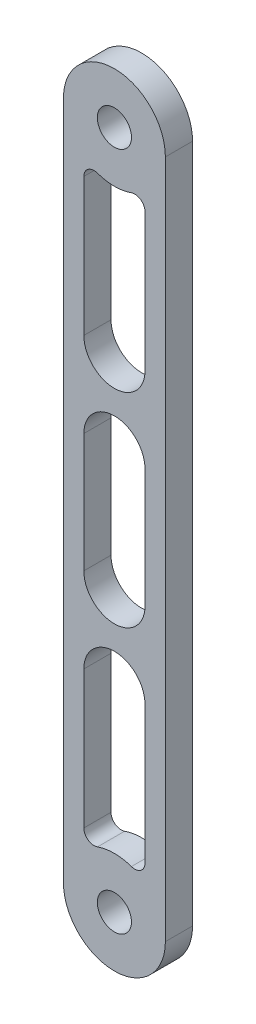
ISO-10303-21;
HEADER;
FILE_DESCRIPTION(('STEP AP214'),'2;1');
FILE_NAME('part.step','',(''),(''),'','','');
FILE_SCHEMA(('AUTOMOTIVE_DESIGN { 1 0 10303 214 1 1 1 1 }'));
ENDSEC;
DATA;
#1=APPLICATION_CONTEXT('core data for automotive mechanical design processes');
#2=APPLICATION_PROTOCOL_DEFINITION('international standard','automotive_design',2000,#1);
#3=PRODUCT_CONTEXT('',#1,'mechanical');
#4=PRODUCT('Part','Part','',(#3));
#5=PRODUCT_RELATED_PRODUCT_CATEGORY('part','',(#4));
#6=PRODUCT_DEFINITION_FORMATION('','',#4);
#7=PRODUCT_DEFINITION_CONTEXT('part definition',#1,'design');
#8=PRODUCT_DEFINITION('design','',#6,#7);
#9=PRODUCT_DEFINITION_SHAPE('','',#8);
#10=(LENGTH_UNIT() NAMED_UNIT(*) SI_UNIT(.MILLI.,.METRE.));
#11=(NAMED_UNIT(*) PLANE_ANGLE_UNIT() SI_UNIT($,.RADIAN.));
#12=(NAMED_UNIT(*) SI_UNIT($,.STERADIAN.) SOLID_ANGLE_UNIT());
#13=UNCERTAINTY_MEASURE_WITH_UNIT(LENGTH_MEASURE(1.E-05),#10,'distance_accuracy_value','');
#14=(GEOMETRIC_REPRESENTATION_CONTEXT(3) GLOBAL_UNCERTAINTY_ASSIGNED_CONTEXT((#13)) GLOBAL_UNIT_ASSIGNED_CONTEXT((#10,
#11,#12)) REPRESENTATION_CONTEXT('',''));
#15=CARTESIAN_POINT('',(0.,0.,0.));
#16=DIRECTION('',(0.,0.,1.));
#17=DIRECTION('',(1.,0.,0.));
#18=AXIS2_PLACEMENT_3D('',#15,#16,#17);
#19=CARTESIAN_POINT('',(0.,0.,8.));
#20=DIRECTION('',(0.,0.,1.));
#21=DIRECTION('',(1.,0.,0.));
#22=AXIS2_PLACEMENT_3D('',#19,#20,#21);
#23=PLANE('',#22);
#24=CARTESIAN_POINT('',(0.,0.,8.));
#25=DIRECTION('',(0.,0.,1.));
#26=DIRECTION('',(1.,0.,0.));
#27=AXIS2_PLACEMENT_3D('',#24,#25,#26);
#28=CIRCLE('',#27,5.025);
#29=CARTESIAN_POINT('',(5.025,0.,8.));
#30=VERTEX_POINT('',#29);
#31=EDGE_CURVE('E314',#30,#30,#28,.T.);
#32=ORIENTED_EDGE('',*,*,#31,.F.);
#33=EDGE_LOOP('',(#32));
#34=FACE_BOUND('',#33,.T.);
#35=CARTESIAN_POINT('',(0.,0.,8.));
#36=DIRECTION('',(0.,0.,1.));
#37=DIRECTION('',(1.,0.,0.));
#38=AXIS2_PLACEMENT_3D('',#35,#36,#37);
#39=CIRCLE('',#38,15.);
#40=CARTESIAN_POINT('',(15.,0.,8.));
#41=VERTEX_POINT('',#40);
#42=CARTESIAN_POINT('',(-15.,0.,8.));
#43=VERTEX_POINT('',#42);
#44=EDGE_CURVE('E320',#41,#43,#39,.T.);
#45=ORIENTED_EDGE('',*,*,#44,.T.);
#46=DIRECTION('',(0.,-1.,0.));
#47=VECTOR('',#46,1.);
#48=CARTESIAN_POINT('',(-15.,0.,8.));
#49=LINE('',#48,#47);
#50=CARTESIAN_POINT('',(-15.,-200.,8.));
#51=VERTEX_POINT('',#50);
#52=EDGE_CURVE('E323',#43,#51,#49,.T.);
#53=ORIENTED_EDGE('',*,*,#52,.T.);
#54=CARTESIAN_POINT('',(0.,-200.,8.));
#55=DIRECTION('',(0.,0.,1.));
#56=DIRECTION('',(1.,0.,0.));
#57=AXIS2_PLACEMENT_3D('',#54,#55,#56);
#58=CIRCLE('',#57,15.);
#59=CARTESIAN_POINT('',(15.,-200.,8.));
#60=VERTEX_POINT('',#59);
#61=EDGE_CURVE('E326',#51,#60,#58,.T.);
#62=ORIENTED_EDGE('',*,*,#61,.T.);
#63=DIRECTION('',(0.,1.,0.));
#64=VECTOR('',#63,1.);
#65=CARTESIAN_POINT('',(15.,0.,8.));
#66=LINE('',#65,#64);
#67=EDGE_CURVE('E328',#60,#41,#66,.T.);
#68=ORIENTED_EDGE('',*,*,#67,.T.);
#69=EDGE_LOOP('',(#45,#53,#62,#68));
#70=FACE_BOUND('',#69,.T.);
#71=CARTESIAN_POINT('',(0.,-200.,8.));
#72=DIRECTION('',(0.,0.,1.));
#73=DIRECTION('',(1.,0.,0.));
#74=AXIS2_PLACEMENT_3D('',#71,#72,#73);
#75=CIRCLE('',#74,5.025);
#76=CARTESIAN_POINT('',(5.025,-200.,8.));
#77=VERTEX_POINT('',#76);
#78=EDGE_CURVE('E308',#77,#77,#75,.T.);
#79=ORIENTED_EDGE('',*,*,#78,.F.);
#80=EDGE_LOOP('',(#79));
#81=FACE_BOUND('',#80,.T.);
#82=DIRECTION('',(0.,1.,0.));
#83=VECTOR('',#82,1.);
#84=CARTESIAN_POINT('',(9.,-16.9705627484771,8.));
#85=LINE('',#84,#83);
#86=CARTESIAN_POINT('',(9.,-57.5,8.));
#87=VERTEX_POINT('',#86);
#88=CARTESIAN_POINT('',(9.,-16.9705627484771,8.));
#89=VERTEX_POINT('',#88);
#90=EDGE_CURVE('E265',#87,#89,#85,.T.);
#91=ORIENTED_EDGE('',*,*,#90,.F.);
#92=CARTESIAN_POINT('',(0.,-57.5,8.));
#93=DIRECTION('',(0.,0.,1.));
#94=DIRECTION('',(1.,0.,0.));
#95=AXIS2_PLACEMENT_3D('',#92,#93,#94);
#96=CIRCLE('',#95,9.);
#97=CARTESIAN_POINT('',(-9.,-57.5,8.));
#98=VERTEX_POINT('',#97);
#99=EDGE_CURVE('E263',#98,#87,#96,.T.);
#100=ORIENTED_EDGE('',*,*,#99,.F.);
#101=DIRECTION('',(0.,-1.,0.));
#102=VECTOR('',#101,1.);
#103=CARTESIAN_POINT('',(-9.,-16.9705627484771,8.));
#104=LINE('',#103,#102);
#105=CARTESIAN_POINT('',(-9.,-16.9705627484771,8.));
#106=VERTEX_POINT('',#105);
#107=EDGE_CURVE('E275',#106,#98,#104,.T.);
#108=ORIENTED_EDGE('',*,*,#107,.F.);
#109=CARTESIAN_POINT('',(-6.,-16.9705627484771,8.));
#110=DIRECTION('',(0.,0.,1.));
#111=DIRECTION('',(1.,0.,0.));
#112=AXIS2_PLACEMENT_3D('',#109,#110,#111);
#113=CIRCLE('',#112,3.);
#114=CARTESIAN_POINT('',(-5.,-14.142135623731,8.));
#115=VERTEX_POINT('',#114);
#116=EDGE_CURVE('E272',#115,#106,#113,.T.);
#117=ORIENTED_EDGE('',*,*,#116,.F.);
#118=CARTESIAN_POINT('',(0.,0.,8.));
#119=DIRECTION('',(0.,0.,-1.));
#120=DIRECTION('',(1.,0.,0.));
#121=AXIS2_PLACEMENT_3D('',#118,#119,#120);
#122=CIRCLE('',#121,15.);
#123=CARTESIAN_POINT('',(5.,-14.142135623731,8.));
#124=VERTEX_POINT('',#123);
#125=EDGE_CURVE('E270',#124,#115,#122,.T.);
#126=ORIENTED_EDGE('',*,*,#125,.F.);
#127=CARTESIAN_POINT('',(6.,-16.9705627484771,8.));
#128=DIRECTION('',(0.,0.,1.));
#129=DIRECTION('',(1.,0.,0.));
#130=AXIS2_PLACEMENT_3D('',#127,#128,#129);
#131=CIRCLE('',#130,3.);
#132=EDGE_CURVE('E268',#89,#124,#131,.T.);
#133=ORIENTED_EDGE('',*,*,#132,.F.);
#134=EDGE_LOOP('',(#91,#100,#108,#117,#126,#133));
#135=FACE_BOUND('',#134,.T.);
#136=DIRECTION('',(0.,-1.,0.));
#137=VECTOR('',#136,1.);
#138=CARTESIAN_POINT('',(-8.99999999999999,-82.5,8.));
#139=LINE('',#138,#137);
#140=CARTESIAN_POINT('',(-8.99999999999999,-82.5,8.));
#141=VERTEX_POINT('',#140);
#142=CARTESIAN_POINT('',(-8.99999999999999,-117.5,8.));
#143=VERTEX_POINT('',#142);
#144=EDGE_CURVE('E234',#141,#143,#139,.T.);
#145=ORIENTED_EDGE('',*,*,#144,.F.);
#146=CARTESIAN_POINT('',(0.,-82.5,8.));
#147=DIRECTION('',(0.,0.,1.));
#148=DIRECTION('',(1.,0.,0.));
#149=AXIS2_PLACEMENT_3D('',#146,#147,#148);
#150=CIRCLE('',#149,9.);
#151=CARTESIAN_POINT('',(9.00000000000001,-82.5,8.));
#152=VERTEX_POINT('',#151);
#153=EDGE_CURVE('E232',#152,#141,#150,.T.);
#154=ORIENTED_EDGE('',*,*,#153,.F.);
#155=DIRECTION('',(0.,1.,0.));
#156=VECTOR('',#155,1.);
#157=CARTESIAN_POINT('',(9.00000000000001,-82.5,8.));
#158=LINE('',#157,#156);
#159=CARTESIAN_POINT('',(9.00000000000002,-117.5,8.));
#160=VERTEX_POINT('',#159);
#161=EDGE_CURVE('E240',#160,#152,#158,.T.);
#162=ORIENTED_EDGE('',*,*,#161,.F.);
#163=CARTESIAN_POINT('',(0.,-117.5,8.));
#164=DIRECTION('',(0.,0.,1.));
#165=DIRECTION('',(1.,0.,0.));
#166=AXIS2_PLACEMENT_3D('',#163,#164,#165);
#167=CIRCLE('',#166,9.);
#168=EDGE_CURVE('E237',#143,#160,#167,.T.);
#169=ORIENTED_EDGE('',*,*,#168,.F.);
#170=EDGE_LOOP('',(#145,#154,#162,#169));
#171=FACE_BOUND('',#170,.T.);
#172=CARTESIAN_POINT('',(6.,-183.029437251523,8.));
#173=DIRECTION('',(0.,0.,1.));
#174=DIRECTION('',(-1.,0.,0.));
#175=AXIS2_PLACEMENT_3D('',#172,#173,#174);
#176=CIRCLE('',#175,3.);
#177=CARTESIAN_POINT('',(5.,-185.857864376269,8.));
#178=VERTEX_POINT('',#177);
#179=CARTESIAN_POINT('',(9.,-183.029437251523,8.));
#180=VERTEX_POINT('',#179);
#181=EDGE_CURVE('E189',#178,#180,#176,.T.);
#182=ORIENTED_EDGE('',*,*,#181,.F.);
#183=CARTESIAN_POINT('',(0.,-200.,8.));
#184=DIRECTION('',(0.,0.,-1.));
#185=DIRECTION('',(-1.,0.,0.));
#186=AXIS2_PLACEMENT_3D('',#183,#184,#185);
#187=CIRCLE('',#186,15.);
#188=CARTESIAN_POINT('',(-4.99999999999999,-185.857864376269,8.));
#189=VERTEX_POINT('',#188);
#190=EDGE_CURVE('E181',#189,#178,#187,.T.);
#191=ORIENTED_EDGE('',*,*,#190,.F.);
#192=CARTESIAN_POINT('',(-6.,-183.029437251523,8.));
#193=DIRECTION('',(0.,0.,1.));
#194=DIRECTION('',(-1.,0.,0.));
#195=AXIS2_PLACEMENT_3D('',#192,#193,#194);
#196=CIRCLE('',#195,3.);
#197=CARTESIAN_POINT('',(-8.99999999999999,-183.029437251523,8.));
#198=VERTEX_POINT('',#197);
#199=EDGE_CURVE('E210',#198,#189,#196,.T.);
#200=ORIENTED_EDGE('',*,*,#199,.F.);
#201=DIRECTION('',(0.,-1.,0.));
#202=VECTOR('',#201,1.);
#203=CARTESIAN_POINT('',(-9.,-183.029437251523,8.));
#204=LINE('',#203,#202);
#205=CARTESIAN_POINT('',(-9.,-142.5,8.));
#206=VERTEX_POINT('',#205);
#207=EDGE_CURVE('E208',#206,#198,#204,.T.);
#208=ORIENTED_EDGE('',*,*,#207,.F.);
#209=CARTESIAN_POINT('',(0.,-142.5,8.));
#210=DIRECTION('',(0.,0.,1.));
#211=DIRECTION('',(-1.,0.,0.));
#212=AXIS2_PLACEMENT_3D('',#209,#210,#211);
#213=CIRCLE('',#212,9.);
#214=CARTESIAN_POINT('',(9.,-142.5,8.));
#215=VERTEX_POINT('',#214);
#216=EDGE_CURVE('E204',#215,#206,#213,.T.);
#217=ORIENTED_EDGE('',*,*,#216,.F.);
#218=DIRECTION('',(0.,1.,0.));
#219=VECTOR('',#218,1.);
#220=CARTESIAN_POINT('',(9.,-183.029437251523,8.));
#221=LINE('',#220,#219);
#222=EDGE_CURVE('E202',#180,#215,#221,.T.);
#223=ORIENTED_EDGE('',*,*,#222,.F.);
#224=EDGE_LOOP('',(#182,#191,#200,#208,#217,#223));
#225=FACE_BOUND('',#224,.T.);
#226=ADVANCED_FACE('F44',(#34,#70,#81,#135,#171,#225),#23,.T.);
#227=CARTESIAN_POINT('',(0.,0.,0.));
#228=DIRECTION('',(0.,0.,1.));
#229=DIRECTION('',(1.,0.,0.));
#230=AXIS2_PLACEMENT_3D('',#227,#228,#229);
#231=PLANE('',#230);
#232=CARTESIAN_POINT('',(0.,-82.5,0.));
#233=DIRECTION('',(0.,0.,1.));
#234=DIRECTION('',(1.,0.,0.));
#235=AXIS2_PLACEMENT_3D('',#232,#233,#234);
#236=CIRCLE('',#235,9.);
#237=CARTESIAN_POINT('',(9.00000000000001,-82.5,0.));
#238=VERTEX_POINT('',#237);
#239=CARTESIAN_POINT('',(-8.99999999999999,-82.5,0.));
#240=VERTEX_POINT('',#239);
#241=EDGE_CURVE('E197',#238,#240,#236,.T.);
#242=ORIENTED_EDGE('',*,*,#241,.T.);
#243=DIRECTION('',(0.,-1.,0.));
#244=VECTOR('',#243,1.);
#245=CARTESIAN_POINT('',(-8.99999999999999,-82.5,0.));
#246=LINE('',#245,#244);
#247=CARTESIAN_POINT('',(-8.99999999999999,-117.5,0.));
#248=VERTEX_POINT('',#247);
#249=EDGE_CURVE('E245',#240,#248,#246,.T.);
#250=ORIENTED_EDGE('',*,*,#249,.T.);
#251=CARTESIAN_POINT('',(0.,-117.5,0.));
#252=DIRECTION('',(0.,0.,1.));
#253=DIRECTION('',(1.,0.,0.));
#254=AXIS2_PLACEMENT_3D('',#251,#252,#253);
#255=CIRCLE('',#254,9.);
#256=CARTESIAN_POINT('',(9.00000000000002,-117.5,0.));
#257=VERTEX_POINT('',#256);
#258=EDGE_CURVE('E248',#248,#257,#255,.T.);
#259=ORIENTED_EDGE('',*,*,#258,.T.);
#260=DIRECTION('',(0.,1.,0.));
#261=VECTOR('',#260,1.);
#262=CARTESIAN_POINT('',(9.00000000000001,-82.5,0.));
#263=LINE('',#262,#261);
#264=EDGE_CURVE('E235',#257,#238,#263,.T.);
#265=ORIENTED_EDGE('',*,*,#264,.T.);
#266=EDGE_LOOP('',(#242,#250,#259,#265));
#267=FACE_BOUND('',#266,.T.);
#268=CARTESIAN_POINT('',(0.,-200.,0.));
#269=DIRECTION('',(0.,0.,1.));
#270=DIRECTION('',(1.,0.,0.));
#271=AXIS2_PLACEMENT_3D('',#268,#269,#270);
#272=CIRCLE('',#271,5.025);
#273=CARTESIAN_POINT('',(5.025,-200.,0.));
#274=VERTEX_POINT('',#273);
#275=EDGE_CURVE('E307',#274,#274,#272,.T.);
#276=ORIENTED_EDGE('',*,*,#275,.T.);
#277=EDGE_LOOP('',(#276));
#278=FACE_BOUND('',#277,.T.);
#279=CARTESIAN_POINT('',(0.,0.,0.));
#280=DIRECTION('',(0.,0.,1.));
#281=DIRECTION('',(1.,0.,0.));
#282=AXIS2_PLACEMENT_3D('',#279,#280,#281);
#283=CIRCLE('',#282,5.025);
#284=CARTESIAN_POINT('',(5.025,0.,0.));
#285=VERTEX_POINT('',#284);
#286=EDGE_CURVE('E311',#285,#285,#283,.T.);
#287=ORIENTED_EDGE('',*,*,#286,.T.);
#288=EDGE_LOOP('',(#287));
#289=FACE_BOUND('',#288,.T.);
#290=CARTESIAN_POINT('',(0.,0.,0.));
#291=DIRECTION('',(0.,0.,1.));
#292=DIRECTION('',(1.,0.,0.));
#293=AXIS2_PLACEMENT_3D('',#290,#291,#292);
#294=CIRCLE('',#293,15.);
#295=CARTESIAN_POINT('',(15.,0.,0.));
#296=VERTEX_POINT('',#295);
#297=CARTESIAN_POINT('',(-15.,0.,0.));
#298=VERTEX_POINT('',#297);
#299=EDGE_CURVE('E317',#296,#298,#294,.T.);
#300=ORIENTED_EDGE('',*,*,#299,.F.);
#301=DIRECTION('',(0.,1.,0.));
#302=VECTOR('',#301,1.);
#303=CARTESIAN_POINT('',(15.,0.,0.));
#304=LINE('',#303,#302);
#305=CARTESIAN_POINT('',(15.,-200.,0.));
#306=VERTEX_POINT('',#305);
#307=EDGE_CURVE('E324',#306,#296,#304,.T.);
#308=ORIENTED_EDGE('',*,*,#307,.F.);
#309=CARTESIAN_POINT('',(0.,-200.,0.));
#310=DIRECTION('',(0.,0.,1.));
#311=DIRECTION('',(1.,0.,0.));
#312=AXIS2_PLACEMENT_3D('',#309,#310,#311);
#313=CIRCLE('',#312,15.);
#314=CARTESIAN_POINT('',(-15.,-200.,0.));
#315=VERTEX_POINT('',#314);
#316=EDGE_CURVE('E335',#315,#306,#313,.T.);
#317=ORIENTED_EDGE('',*,*,#316,.F.);
#318=DIRECTION('',(0.,-1.,0.));
#319=VECTOR('',#318,1.);
#320=CARTESIAN_POINT('',(-15.,0.,0.));
#321=LINE('',#320,#319);
#322=EDGE_CURVE('E333',#298,#315,#321,.T.);
#323=ORIENTED_EDGE('',*,*,#322,.F.);
#324=EDGE_LOOP('',(#300,#308,#317,#323));
#325=FACE_BOUND('',#324,.T.);
#326=CARTESIAN_POINT('',(0.,-57.5,0.));
#327=DIRECTION('',(0.,0.,1.));
#328=DIRECTION('',(1.,0.,0.));
#329=AXIS2_PLACEMENT_3D('',#326,#327,#328);
#330=CIRCLE('',#329,9.);
#331=CARTESIAN_POINT('',(-9.,-57.5,0.));
#332=VERTEX_POINT('',#331);
#333=CARTESIAN_POINT('',(9.,-57.5,0.));
#334=VERTEX_POINT('',#333);
#335=EDGE_CURVE('E262',#332,#334,#330,.T.);
#336=ORIENTED_EDGE('',*,*,#335,.T.);
#337=DIRECTION('',(0.,1.,0.));
#338=VECTOR('',#337,1.);
#339=CARTESIAN_POINT('',(9.,-16.9705627484771,0.));
#340=LINE('',#339,#338);
#341=CARTESIAN_POINT('',(9.,-16.9705627484771,0.));
#342=VERTEX_POINT('',#341);
#343=EDGE_CURVE('E280',#334,#342,#340,.T.);
#344=ORIENTED_EDGE('',*,*,#343,.T.);
#345=CARTESIAN_POINT('',(6.,-16.9705627484771,0.));
#346=DIRECTION('',(0.,0.,1.));
#347=DIRECTION('',(1.,0.,0.));
#348=AXIS2_PLACEMENT_3D('',#345,#346,#347);
#349=CIRCLE('',#348,3.);
#350=CARTESIAN_POINT('',(5.,-14.142135623731,0.));
#351=VERTEX_POINT('',#350);
#352=EDGE_CURVE('E283',#342,#351,#349,.T.);
#353=ORIENTED_EDGE('',*,*,#352,.T.);
#354=CARTESIAN_POINT('',(0.,0.,0.));
#355=DIRECTION('',(0.,0.,-1.));
#356=DIRECTION('',(1.,0.,0.));
#357=AXIS2_PLACEMENT_3D('',#354,#355,#356);
#358=CIRCLE('',#357,15.);
#359=CARTESIAN_POINT('',(-5.,-14.142135623731,0.));
#360=VERTEX_POINT('',#359);
#361=EDGE_CURVE('E286',#351,#360,#358,.T.);
#362=ORIENTED_EDGE('',*,*,#361,.T.);
#363=CARTESIAN_POINT('',(-6.,-16.9705627484771,0.));
#364=DIRECTION('',(0.,0.,1.));
#365=DIRECTION('',(1.,0.,0.));
#366=AXIS2_PLACEMENT_3D('',#363,#364,#365);
#367=CIRCLE('',#366,3.);
#368=CARTESIAN_POINT('',(-9.,-16.9705627484771,0.));
#369=VERTEX_POINT('',#368);
#370=EDGE_CURVE('E289',#360,#369,#367,.T.);
#371=ORIENTED_EDGE('',*,*,#370,.T.);
#372=DIRECTION('',(0.,-1.,0.));
#373=VECTOR('',#372,1.);
#374=CARTESIAN_POINT('',(-9.,-16.9705627484771,0.));
#375=LINE('',#374,#373);
#376=EDGE_CURVE('E266',#369,#332,#375,.T.);
#377=ORIENTED_EDGE('',*,*,#376,.T.);
#378=EDGE_LOOP('',(#336,#344,#353,#362,#371,#377));
#379=FACE_BOUND('',#378,.T.);
#380=CARTESIAN_POINT('',(0.,-200.,0.));
#381=DIRECTION('',(0.,0.,-1.));
#382=DIRECTION('',(-1.,0.,0.));
#383=AXIS2_PLACEMENT_3D('',#380,#381,#382);
#384=CIRCLE('',#383,15.);
#385=CARTESIAN_POINT('',(-4.99999999999999,-185.857864376269,0.));
#386=VERTEX_POINT('',#385);
#387=CARTESIAN_POINT('',(5.,-185.857864376269,0.));
#388=VERTEX_POINT('',#387);
#389=EDGE_CURVE('E67',#386,#388,#384,.T.);
#390=ORIENTED_EDGE('',*,*,#389,.T.);
#391=CARTESIAN_POINT('',(6.,-183.029437251523,0.));
#392=DIRECTION('',(0.,0.,1.));
#393=DIRECTION('',(-1.,0.,0.));
#394=AXIS2_PLACEMENT_3D('',#391,#392,#393);
#395=CIRCLE('',#394,3.);
#396=CARTESIAN_POINT('',(9.,-183.029437251523,0.));
#397=VERTEX_POINT('',#396);
#398=EDGE_CURVE('E196',#388,#397,#395,.T.);
#399=ORIENTED_EDGE('',*,*,#398,.T.);
#400=DIRECTION('',(0.,1.,0.));
#401=VECTOR('',#400,1.);
#402=CARTESIAN_POINT('',(9.,-183.029437251523,0.));
#403=LINE('',#402,#401);
#404=CARTESIAN_POINT('',(9.,-142.5,0.));
#405=VERTEX_POINT('',#404);
#406=EDGE_CURVE('E214',#397,#405,#403,.T.);
#407=ORIENTED_EDGE('',*,*,#406,.T.);
#408=CARTESIAN_POINT('',(0.,-142.5,0.));
#409=DIRECTION('',(0.,0.,1.));
#410=DIRECTION('',(-1.,0.,0.));
#411=AXIS2_PLACEMENT_3D('',#408,#409,#410);
#412=CIRCLE('',#411,9.);
#413=CARTESIAN_POINT('',(-9.,-142.5,0.));
#414=VERTEX_POINT('',#413);
#415=EDGE_CURVE('E217',#405,#414,#412,.T.);
#416=ORIENTED_EDGE('',*,*,#415,.T.);
#417=DIRECTION('',(0.,-1.,0.));
#418=VECTOR('',#417,1.);
#419=CARTESIAN_POINT('',(-9.,-183.029437251523,0.));
#420=LINE('',#419,#418);
#421=CARTESIAN_POINT('',(-8.99999999999999,-183.029437251523,0.));
#422=VERTEX_POINT('',#421);
#423=EDGE_CURVE('E220',#414,#422,#420,.T.);
#424=ORIENTED_EDGE('',*,*,#423,.T.);
#425=CARTESIAN_POINT('',(-6.,-183.029437251523,0.));
#426=DIRECTION('',(0.,0.,1.));
#427=DIRECTION('',(-1.,0.,0.));
#428=AXIS2_PLACEMENT_3D('',#425,#426,#427);
#429=CIRCLE('',#428,3.);
#430=EDGE_CURVE('E190',#422,#386,#429,.T.);
#431=ORIENTED_EDGE('',*,*,#430,.T.);
#432=EDGE_LOOP('',(#390,#399,#407,#416,#424,#431));
#433=FACE_BOUND('',#432,.T.);
#434=ADVANCED_FACE('F353',(#267,#278,#289,#325,#379,#433),#231,.F.);
#435=CARTESIAN_POINT('',(0.,0.,8.));
#436=DIRECTION('',(0.,0.,-1.));
#437=DIRECTION('',(-1.,0.,0.));
#438=AXIS2_PLACEMENT_3D('',#435,#436,#437);
#439=CYLINDRICAL_SURFACE('',#438,15.);
#440=ORIENTED_EDGE('',*,*,#299,.T.);
#441=DIRECTION('',(0.,0.,-1.));
#442=VECTOR('',#441,1.);
#443=CARTESIAN_POINT('',(-15.,0.,8.));
#444=LINE('',#443,#442);
#445=EDGE_CURVE('E11',#43,#298,#444,.T.);
#446=ORIENTED_EDGE('',*,*,#445,.F.);
#447=ORIENTED_EDGE('',*,*,#44,.F.);
#448=DIRECTION('',(0.,0.,-1.));
#449=VECTOR('',#448,1.);
#450=CARTESIAN_POINT('',(15.,0.,8.));
#451=LINE('',#450,#449);
#452=EDGE_CURVE('E330',#41,#296,#451,.T.);
#453=ORIENTED_EDGE('',*,*,#452,.T.);
#454=EDGE_LOOP('',(#440,#446,#447,#453));
#455=FACE_BOUND('',#454,.T.);
#456=ADVANCED_FACE('F46',(#455),#439,.T.);
#457=CARTESIAN_POINT('',(-15.,0.,8.));
#458=DIRECTION('',(1.,0.,0.));
#459=DIRECTION('',(0.,1.,0.));
#460=AXIS2_PLACEMENT_3D('',#457,#458,#459);
#461=PLANE('',#460);
#462=ORIENTED_EDGE('',*,*,#322,.T.);
#463=DIRECTION('',(0.,0.,-1.));
#464=VECTOR('',#463,1.);
#465=CARTESIAN_POINT('',(-15.,-200.,8.));
#466=LINE('',#465,#464);
#467=EDGE_CURVE('E52',#51,#315,#466,.T.);
#468=ORIENTED_EDGE('',*,*,#467,.F.);
#469=ORIENTED_EDGE('',*,*,#52,.F.);
#470=ORIENTED_EDGE('',*,*,#445,.T.);
#471=EDGE_LOOP('',(#462,#468,#469,#470));
#472=FACE_BOUND('',#471,.T.);
#473=ADVANCED_FACE('F364',(#472),#461,.F.);
#474=CARTESIAN_POINT('',(0.,-200.,8.));
#475=DIRECTION('',(0.,0.,-1.));
#476=DIRECTION('',(-1.,0.,0.));
#477=AXIS2_PLACEMENT_3D('',#474,#475,#476);
#478=CYLINDRICAL_SURFACE('',#477,15.);
#479=ORIENTED_EDGE('',*,*,#316,.T.);
#480=DIRECTION('',(0.,0.,-1.));
#481=VECTOR('',#480,1.);
#482=CARTESIAN_POINT('',(15.,-200.,8.));
#483=LINE('',#482,#481);
#484=EDGE_CURVE('E340',#60,#306,#483,.T.);
#485=ORIENTED_EDGE('',*,*,#484,.F.);
#486=ORIENTED_EDGE('',*,*,#61,.F.);
#487=ORIENTED_EDGE('',*,*,#467,.T.);
#488=EDGE_LOOP('',(#479,#485,#486,#487));
#489=FACE_BOUND('',#488,.T.);
#490=ADVANCED_FACE('F347',(#489),#478,.T.);
#491=CARTESIAN_POINT('',(15.,0.,8.));
#492=DIRECTION('',(-1.,0.,0.));
#493=DIRECTION('',(0.,-1.,0.));
#494=AXIS2_PLACEMENT_3D('',#491,#492,#493);
#495=PLANE('',#494);
#496=ORIENTED_EDGE('',*,*,#307,.T.);
#497=ORIENTED_EDGE('',*,*,#452,.F.);
#498=ORIENTED_EDGE('',*,*,#67,.F.);
#499=ORIENTED_EDGE('',*,*,#484,.T.);
#500=EDGE_LOOP('',(#496,#497,#498,#499));
#501=FACE_BOUND('',#500,.T.);
#502=ADVANCED_FACE('F357',(#501),#495,.F.);
#503=CARTESIAN_POINT('',(0.,0.,8.));
#504=DIRECTION('',(0.,0.,-1.));
#505=DIRECTION('',(-1.,0.,0.));
#506=AXIS2_PLACEMENT_3D('',#503,#504,#505);
#507=CYLINDRICAL_SURFACE('',#506,5.025);
#508=ORIENTED_EDGE('',*,*,#31,.T.);
#509=EDGE_LOOP('',(#508));
#510=FACE_BOUND('',#509,.T.);
#511=ORIENTED_EDGE('',*,*,#286,.F.);
#512=EDGE_LOOP('',(#511));
#513=FACE_BOUND('',#512,.T.);
#514=ADVANCED_FACE('F381',(#510,#513),#507,.F.);
#515=CARTESIAN_POINT('',(0.,-200.,8.));
#516=DIRECTION('',(0.,0.,-1.));
#517=DIRECTION('',(-1.,0.,0.));
#518=AXIS2_PLACEMENT_3D('',#515,#516,#517);
#519=CYLINDRICAL_SURFACE('',#518,5.025);
#520=ORIENTED_EDGE('',*,*,#78,.T.);
#521=EDGE_LOOP('',(#520));
#522=FACE_BOUND('',#521,.T.);
#523=ORIENTED_EDGE('',*,*,#275,.F.);
#524=EDGE_LOOP('',(#523));
#525=FACE_BOUND('',#524,.T.);
#526=ADVANCED_FACE('F388',(#522,#525),#519,.F.);
#527=CARTESIAN_POINT('',(0.,-57.5,8.));
#528=DIRECTION('',(0.,0.,-1.));
#529=DIRECTION('',(-1.,0.,0.));
#530=AXIS2_PLACEMENT_3D('',#527,#528,#529);
#531=CYLINDRICAL_SURFACE('',#530,9.);
#532=ORIENTED_EDGE('',*,*,#335,.F.);
#533=DIRECTION('',(0.,0.,-1.));
#534=VECTOR('',#533,1.);
#535=CARTESIAN_POINT('',(-9.,-57.5,8.));
#536=LINE('',#535,#534);
#537=EDGE_CURVE('E277',#98,#332,#536,.T.);
#538=ORIENTED_EDGE('',*,*,#537,.F.);
#539=ORIENTED_EDGE('',*,*,#99,.T.);
#540=DIRECTION('',(0.,0.,-1.));
#541=VECTOR('',#540,1.);
#542=CARTESIAN_POINT('',(9.,-57.5,8.));
#543=LINE('',#542,#541);
#544=EDGE_CURVE('E304',#87,#334,#543,.T.);
#545=ORIENTED_EDGE('',*,*,#544,.T.);
#546=EDGE_LOOP('',(#532,#538,#539,#545));
#547=FACE_BOUND('',#546,.T.);
#548=ADVANCED_FACE('F393',(#547),#531,.F.);
#549=CARTESIAN_POINT('',(9.,-16.9705627484771,8.));
#550=DIRECTION('',(-1.,0.,0.));
#551=DIRECTION('',(0.,-1.,0.));
#552=AXIS2_PLACEMENT_3D('',#549,#550,#551);
#553=PLANE('',#552);
#554=ORIENTED_EDGE('',*,*,#343,.F.);
#555=ORIENTED_EDGE('',*,*,#544,.F.);
#556=ORIENTED_EDGE('',*,*,#90,.T.);
#557=DIRECTION('',(0.,0.,-1.));
#558=VECTOR('',#557,1.);
#559=CARTESIAN_POINT('',(9.,-16.9705627484771,8.));
#560=LINE('',#559,#558);
#561=EDGE_CURVE('E302',#89,#342,#560,.T.);
#562=ORIENTED_EDGE('',*,*,#561,.T.);
#563=EDGE_LOOP('',(#554,#555,#556,#562));
#564=FACE_BOUND('',#563,.T.);
#565=ADVANCED_FACE('F401',(#564),#553,.T.);
#566=CARTESIAN_POINT('',(6.,-16.9705627484771,8.));
#567=DIRECTION('',(0.,0.,-1.));
#568=DIRECTION('',(-1.,0.,0.));
#569=AXIS2_PLACEMENT_3D('',#566,#567,#568);
#570=CYLINDRICAL_SURFACE('',#569,3.);
#571=ORIENTED_EDGE('',*,*,#352,.F.);
#572=ORIENTED_EDGE('',*,*,#561,.F.);
#573=ORIENTED_EDGE('',*,*,#132,.T.);
#574=DIRECTION('',(0.,0.,-1.));
#575=VECTOR('',#574,1.);
#576=CARTESIAN_POINT('',(5.,-14.142135623731,8.));
#577=LINE('',#576,#575);
#578=EDGE_CURVE('E300',#124,#351,#577,.T.);
#579=ORIENTED_EDGE('',*,*,#578,.T.);
#580=EDGE_LOOP('',(#571,#572,#573,#579));
#581=FACE_BOUND('',#580,.T.);
#582=ADVANCED_FACE('F408',(#581),#570,.F.);
#583=CARTESIAN_POINT('',(0.,0.,8.));
#584=DIRECTION('',(0.,0.,-1.));
#585=DIRECTION('',(-1.,0.,0.));
#586=AXIS2_PLACEMENT_3D('',#583,#584,#585);
#587=CYLINDRICAL_SURFACE('',#586,15.);
#588=ORIENTED_EDGE('',*,*,#361,.F.);
#589=ORIENTED_EDGE('',*,*,#578,.F.);
#590=ORIENTED_EDGE('',*,*,#125,.T.);
#591=DIRECTION('',(0.,0.,-1.));
#592=VECTOR('',#591,1.);
#593=CARTESIAN_POINT('',(-5.,-14.142135623731,8.));
#594=LINE('',#593,#592);
#595=EDGE_CURVE('E298',#115,#360,#594,.T.);
#596=ORIENTED_EDGE('',*,*,#595,.T.);
#597=EDGE_LOOP('',(#588,#589,#590,#596));
#598=FACE_BOUND('',#597,.T.);
#599=ADVANCED_FACE('F412',(#598),#587,.T.);
#600=CARTESIAN_POINT('',(-6.,-16.9705627484771,8.));
#601=DIRECTION('',(0.,0.,-1.));
#602=DIRECTION('',(-1.,0.,0.));
#603=AXIS2_PLACEMENT_3D('',#600,#601,#602);
#604=CYLINDRICAL_SURFACE('',#603,3.);
#605=ORIENTED_EDGE('',*,*,#370,.F.);
#606=ORIENTED_EDGE('',*,*,#595,.F.);
#607=ORIENTED_EDGE('',*,*,#116,.T.);
#608=DIRECTION('',(0.,0.,-1.));
#609=VECTOR('',#608,1.);
#610=CARTESIAN_POINT('',(-9.,-16.9705627484771,8.));
#611=LINE('',#610,#609);
#612=EDGE_CURVE('E296',#106,#369,#611,.T.);
#613=ORIENTED_EDGE('',*,*,#612,.T.);
#614=EDGE_LOOP('',(#605,#606,#607,#613));
#615=FACE_BOUND('',#614,.T.);
#616=ADVANCED_FACE('F416',(#615),#604,.F.);
#617=CARTESIAN_POINT('',(-9.,-16.9705627484771,8.));
#618=DIRECTION('',(1.,0.,0.));
#619=DIRECTION('',(0.,1.,0.));
#620=AXIS2_PLACEMENT_3D('',#617,#618,#619);
#621=PLANE('',#620);
#622=ORIENTED_EDGE('',*,*,#376,.F.);
#623=ORIENTED_EDGE('',*,*,#612,.F.);
#624=ORIENTED_EDGE('',*,*,#107,.T.);
#625=ORIENTED_EDGE('',*,*,#537,.T.);
#626=EDGE_LOOP('',(#622,#623,#624,#625));
#627=FACE_BOUND('',#626,.T.);
#628=ADVANCED_FACE('F420',(#627),#621,.T.);
#629=CARTESIAN_POINT('',(0.,-82.5,8.));
#630=DIRECTION('',(0.,0.,-1.));
#631=DIRECTION('',(-1.,0.,0.));
#632=AXIS2_PLACEMENT_3D('',#629,#630,#631);
#633=CYLINDRICAL_SURFACE('',#632,9.);
#634=ORIENTED_EDGE('',*,*,#241,.F.);
#635=DIRECTION('',(0.,0.,-1.));
#636=VECTOR('',#635,1.);
#637=CARTESIAN_POINT('',(9.00000000000001,-82.5,8.));
#638=LINE('',#637,#636);
#639=EDGE_CURVE('E242',#152,#238,#638,.T.);
#640=ORIENTED_EDGE('',*,*,#639,.F.);
#641=ORIENTED_EDGE('',*,*,#153,.T.);
#642=DIRECTION('',(0.,0.,-1.));
#643=VECTOR('',#642,1.);
#644=CARTESIAN_POINT('',(-8.99999999999999,-82.5,8.));
#645=LINE('',#644,#643);
#646=EDGE_CURVE('E259',#141,#240,#645,.T.);
#647=ORIENTED_EDGE('',*,*,#646,.T.);
#648=EDGE_LOOP('',(#634,#640,#641,#647));
#649=FACE_BOUND('',#648,.T.);
#650=ADVANCED_FACE('F424',(#649),#633,.F.);
#651=CARTESIAN_POINT('',(-8.99999999999999,-82.5,8.));
#652=DIRECTION('',(1.,0.,0.));
#653=DIRECTION('',(0.,1.,0.));
#654=AXIS2_PLACEMENT_3D('',#651,#652,#653);
#655=PLANE('',#654);
#656=ORIENTED_EDGE('',*,*,#249,.F.);
#657=ORIENTED_EDGE('',*,*,#646,.F.);
#658=ORIENTED_EDGE('',*,*,#144,.T.);
#659=DIRECTION('',(0.,0.,-1.));
#660=VECTOR('',#659,1.);
#661=CARTESIAN_POINT('',(-8.99999999999999,-117.5,8.));
#662=LINE('',#661,#660);
#663=EDGE_CURVE('E257',#143,#248,#662,.T.);
#664=ORIENTED_EDGE('',*,*,#663,.T.);
#665=EDGE_LOOP('',(#656,#657,#658,#664));
#666=FACE_BOUND('',#665,.T.);
#667=ADVANCED_FACE('F428',(#666),#655,.T.);
#668=CARTESIAN_POINT('',(0.,-117.5,8.));
#669=DIRECTION('',(0.,0.,-1.));
#670=DIRECTION('',(-1.,0.,0.));
#671=AXIS2_PLACEMENT_3D('',#668,#669,#670);
#672=CYLINDRICAL_SURFACE('',#671,9.);
#673=ORIENTED_EDGE('',*,*,#258,.F.);
#674=ORIENTED_EDGE('',*,*,#663,.F.);
#675=ORIENTED_EDGE('',*,*,#168,.T.);
#676=DIRECTION('',(0.,0.,-1.));
#677=VECTOR('',#676,1.);
#678=CARTESIAN_POINT('',(9.00000000000002,-117.5,8.));
#679=LINE('',#678,#677);
#680=EDGE_CURVE('E255',#160,#257,#679,.T.);
#681=ORIENTED_EDGE('',*,*,#680,.T.);
#682=EDGE_LOOP('',(#673,#674,#675,#681));
#683=FACE_BOUND('',#682,.T.);
#684=ADVANCED_FACE('F432',(#683),#672,.F.);
#685=CARTESIAN_POINT('',(9.00000000000001,-82.5,8.));
#686=DIRECTION('',(-1.,0.,0.));
#687=DIRECTION('',(0.,-1.,0.));
#688=AXIS2_PLACEMENT_3D('',#685,#686,#687);
#689=PLANE('',#688);
#690=ORIENTED_EDGE('',*,*,#264,.F.);
#691=ORIENTED_EDGE('',*,*,#680,.F.);
#692=ORIENTED_EDGE('',*,*,#161,.T.);
#693=ORIENTED_EDGE('',*,*,#639,.T.);
#694=EDGE_LOOP('',(#690,#691,#692,#693));
#695=FACE_BOUND('',#694,.T.);
#696=ADVANCED_FACE('F436',(#695),#689,.T.);
#697=CARTESIAN_POINT('',(0.,-200.,8.));
#698=DIRECTION('',(0.,0.,-1.));
#699=DIRECTION('',(-1.,0.,0.));
#700=AXIS2_PLACEMENT_3D('',#697,#698,#699);
#701=CYLINDRICAL_SURFACE('',#700,15.);
#702=ORIENTED_EDGE('',*,*,#389,.F.);
#703=DIRECTION('',(0.,0.,-1.));
#704=VECTOR('',#703,1.);
#705=CARTESIAN_POINT('',(-4.99999999999999,-185.857864376269,8.));
#706=LINE('',#705,#704);
#707=EDGE_CURVE('E185',#189,#386,#706,.T.);
#708=ORIENTED_EDGE('',*,*,#707,.F.);
#709=ORIENTED_EDGE('',*,*,#190,.T.);
#710=DIRECTION('',(0.,0.,-1.));
#711=VECTOR('',#710,1.);
#712=CARTESIAN_POINT('',(5.,-185.857864376269,8.));
#713=LINE('',#712,#711);
#714=EDGE_CURVE('E184',#178,#388,#713,.T.);
#715=ORIENTED_EDGE('',*,*,#714,.T.);
#716=EDGE_LOOP('',(#702,#708,#709,#715));
#717=FACE_BOUND('',#716,.T.);
#718=ADVANCED_FACE('F183',(#717),#701,.T.);
#719=CARTESIAN_POINT('',(6.,-183.029437251523,8.));
#720=DIRECTION('',(0.,0.,-1.));
#721=DIRECTION('',(-1.,0.,0.));
#722=AXIS2_PLACEMENT_3D('',#719,#720,#721);
#723=CYLINDRICAL_SURFACE('',#722,3.);
#724=ORIENTED_EDGE('',*,*,#398,.F.);
#725=ORIENTED_EDGE('',*,*,#714,.F.);
#726=ORIENTED_EDGE('',*,*,#181,.T.);
#727=DIRECTION('',(0.,0.,-1.));
#728=VECTOR('',#727,1.);
#729=CARTESIAN_POINT('',(9.,-183.029437251523,8.));
#730=LINE('',#729,#728);
#731=EDGE_CURVE('E198',#180,#397,#730,.T.);
#732=ORIENTED_EDGE('',*,*,#731,.T.);
#733=EDGE_LOOP('',(#724,#725,#726,#732));
#734=FACE_BOUND('',#733,.T.);
#735=ADVANCED_FACE('F193',(#734),#723,.F.);
#736=CARTESIAN_POINT('',(9.,-183.029437251523,8.));
#737=DIRECTION('',(-1.,0.,0.));
#738=DIRECTION('',(0.,-1.,0.));
#739=AXIS2_PLACEMENT_3D('',#736,#737,#738);
#740=PLANE('',#739);
#741=ORIENTED_EDGE('',*,*,#406,.F.);
#742=ORIENTED_EDGE('',*,*,#731,.F.);
#743=ORIENTED_EDGE('',*,*,#222,.T.);
#744=DIRECTION('',(0.,0.,-1.));
#745=VECTOR('',#744,1.);
#746=CARTESIAN_POINT('',(9.,-142.5,8.));
#747=LINE('',#746,#745);
#748=EDGE_CURVE('E229',#215,#405,#747,.T.);
#749=ORIENTED_EDGE('',*,*,#748,.T.);
#750=EDGE_LOOP('',(#741,#742,#743,#749));
#751=FACE_BOUND('',#750,.T.);
#752=ADVANCED_FACE('F445',(#751),#740,.T.);
#753=CARTESIAN_POINT('',(0.,-142.5,8.));
#754=DIRECTION('',(0.,0.,-1.));
#755=DIRECTION('',(-1.,0.,0.));
#756=AXIS2_PLACEMENT_3D('',#753,#754,#755);
#757=CYLINDRICAL_SURFACE('',#756,9.);
#758=ORIENTED_EDGE('',*,*,#415,.F.);
#759=ORIENTED_EDGE('',*,*,#748,.F.);
#760=ORIENTED_EDGE('',*,*,#216,.T.);
#761=DIRECTION('',(0.,0.,-1.));
#762=VECTOR('',#761,1.);
#763=CARTESIAN_POINT('',(-9.,-142.5,8.));
#764=LINE('',#763,#762);
#765=EDGE_CURVE('E227',#206,#414,#764,.T.);
#766=ORIENTED_EDGE('',*,*,#765,.T.);
#767=EDGE_LOOP('',(#758,#759,#760,#766));
#768=FACE_BOUND('',#767,.T.);
#769=ADVANCED_FACE('F448',(#768),#757,.F.);
#770=CARTESIAN_POINT('',(-9.,-183.029437251523,8.));
#771=DIRECTION('',(1.,0.,0.));
#772=DIRECTION('',(0.,1.,0.));
#773=AXIS2_PLACEMENT_3D('',#770,#771,#772);
#774=PLANE('',#773);
#775=ORIENTED_EDGE('',*,*,#423,.F.);
#776=ORIENTED_EDGE('',*,*,#765,.F.);
#777=ORIENTED_EDGE('',*,*,#207,.T.);
#778=DIRECTION('',(0.,0.,-1.));
#779=VECTOR('',#778,1.);
#780=CARTESIAN_POINT('',(-8.99999999999999,-183.029437251523,8.));
#781=LINE('',#780,#779);
#782=EDGE_CURVE('E59',#198,#422,#781,.T.);
#783=ORIENTED_EDGE('',*,*,#782,.T.);
#784=EDGE_LOOP('',(#775,#776,#777,#783));
#785=FACE_BOUND('',#784,.T.);
#786=ADVANCED_FACE('F452',(#785),#774,.T.);
#787=CARTESIAN_POINT('',(-6.,-183.029437251523,8.));
#788=DIRECTION('',(0.,0.,-1.));
#789=DIRECTION('',(-1.,0.,0.));
#790=AXIS2_PLACEMENT_3D('',#787,#788,#789);
#791=CYLINDRICAL_SURFACE('',#790,3.);
#792=ORIENTED_EDGE('',*,*,#430,.F.);
#793=ORIENTED_EDGE('',*,*,#782,.F.);
#794=ORIENTED_EDGE('',*,*,#199,.T.);
#795=ORIENTED_EDGE('',*,*,#707,.T.);
#796=EDGE_LOOP('',(#792,#793,#794,#795));
#797=FACE_BOUND('',#796,.T.);
#798=ADVANCED_FACE('F456',(#797),#791,.F.);
#799=CLOSED_SHELL('',(#226,#434,#456,#473,#490,#502,#514,#526,#548,#565,#582,#599,#616,#628,
#650,#667,#684,#696,#718,#735,#752,#769,#786,#798));
#800=MANIFOLD_SOLID_BREP('B2',#799);
#801=ADVANCED_BREP_SHAPE_REPRESENTATION('',(#18,#800),#14);
#802=SHAPE_DEFINITION_REPRESENTATION(#9,#801);
ENDSEC;
END-ISO-10303-21;
